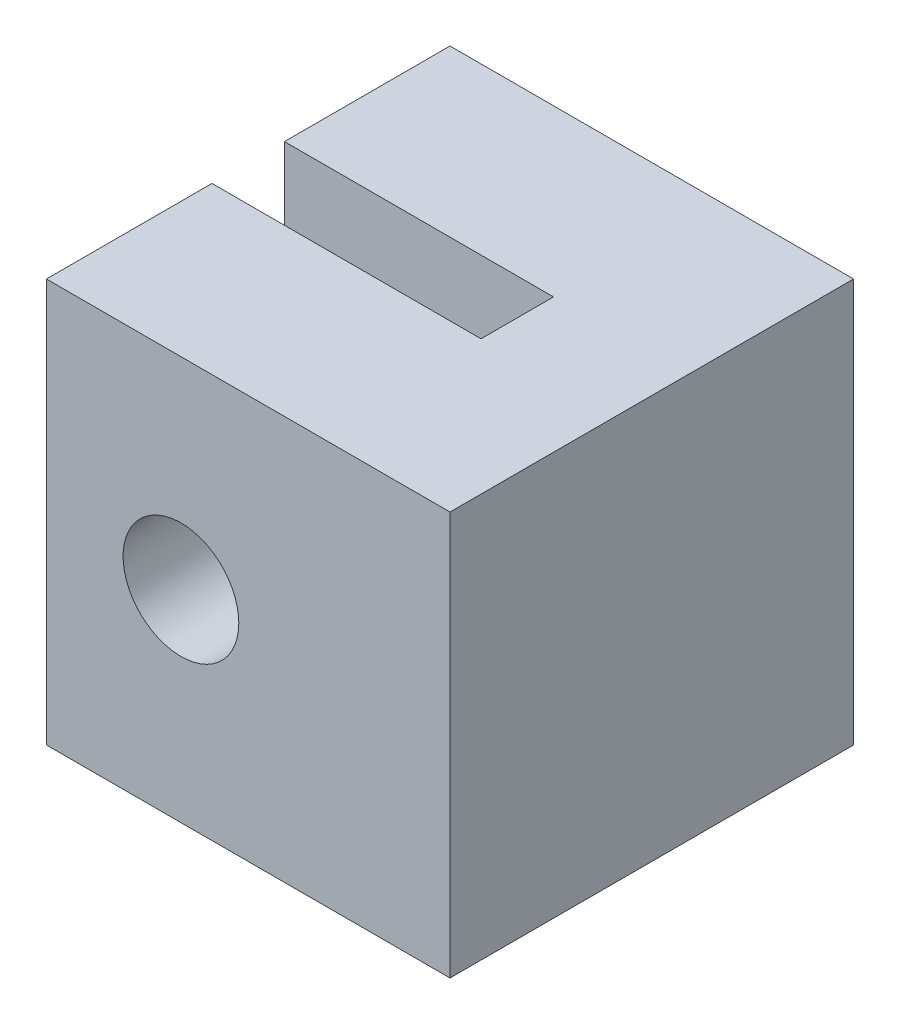
ISO-10303-21;
HEADER;
FILE_DESCRIPTION(('STEP AP214'),'2;1');
FILE_NAME('part.step','',(''),(''),'','','');
FILE_SCHEMA(('AUTOMOTIVE_DESIGN { 1 0 10303 214 1 1 1 1 }'));
ENDSEC;
DATA;
#1=APPLICATION_CONTEXT('core data for automotive mechanical design processes');
#2=APPLICATION_PROTOCOL_DEFINITION('international standard','automotive_design',2000,#1);
#3=PRODUCT_CONTEXT('',#1,'mechanical');
#4=PRODUCT('Part','Part','',(#3));
#5=PRODUCT_RELATED_PRODUCT_CATEGORY('part','',(#4));
#6=PRODUCT_DEFINITION_FORMATION('','',#4);
#7=PRODUCT_DEFINITION_CONTEXT('part definition',#1,'design');
#8=PRODUCT_DEFINITION('design','',#6,#7);
#9=PRODUCT_DEFINITION_SHAPE('','',#8);
#10=(LENGTH_UNIT() NAMED_UNIT(*) SI_UNIT(.MILLI.,.METRE.));
#11=(NAMED_UNIT(*) PLANE_ANGLE_UNIT() SI_UNIT($,.RADIAN.));
#12=(NAMED_UNIT(*) SI_UNIT($,.STERADIAN.) SOLID_ANGLE_UNIT());
#13=UNCERTAINTY_MEASURE_WITH_UNIT(LENGTH_MEASURE(1.E-05),#10,'distance_accuracy_value','');
#14=(GEOMETRIC_REPRESENTATION_CONTEXT(3) GLOBAL_UNCERTAINTY_ASSIGNED_CONTEXT((#13)) GLOBAL_UNIT_ASSIGNED_CONTEXT((#10,
#11,#12)) REPRESENTATION_CONTEXT('',''));
#15=CARTESIAN_POINT('',(0.,0.,0.));
#16=DIRECTION('',(0.,0.,1.));
#17=DIRECTION('',(1.,0.,0.));
#18=AXIS2_PLACEMENT_3D('',#15,#16,#17);
#19=CARTESIAN_POINT('',(-7.5,7.5,15.));
#20=DIRECTION('',(1.,0.,0.));
#21=DIRECTION('',(0.,1.,0.));
#22=AXIS2_PLACEMENT_3D('',#19,#20,#21);
#23=PLANE('',#22);
#24=DIRECTION('',(0.,0.,-1.));
#25=VECTOR('',#24,1.);
#26=CARTESIAN_POINT('',(-7.5,-7.5,15.));
#27=LINE('',#26,#25);
#28=CARTESIAN_POINT('',(-7.5,-7.5,6.152873555));
#29=VERTEX_POINT('',#28);
#30=CARTESIAN_POINT('',(-7.5,-7.5,0.));
#31=VERTEX_POINT('',#30);
#32=EDGE_CURVE('E43',#29,#31,#27,.T.);
#33=ORIENTED_EDGE('',*,*,#32,.F.);
#34=DIRECTION('',(0.,-1.,0.));
#35=VECTOR('',#34,1.);
#36=CARTESIAN_POINT('',(-7.5,7.5,6.152873555));
#37=LINE('',#36,#35);
#38=CARTESIAN_POINT('',(-7.5,7.5,6.152873555));
#39=VERTEX_POINT('',#38);
#40=EDGE_CURVE('E114',#39,#29,#37,.T.);
#41=ORIENTED_EDGE('',*,*,#40,.F.);
#42=DIRECTION('',(0.,0.,-1.));
#43=VECTOR('',#42,1.);
#44=CARTESIAN_POINT('',(-7.5,7.5,15.));
#45=LINE('',#44,#43);
#46=CARTESIAN_POINT('',(-7.5,7.5,0.));
#47=VERTEX_POINT('',#46);
#48=EDGE_CURVE('E81',#39,#47,#45,.T.);
#49=ORIENTED_EDGE('',*,*,#48,.T.);
#50=DIRECTION('',(0.,-1.,0.));
#51=VECTOR('',#50,1.);
#52=CARTESIAN_POINT('',(-7.5,7.5,0.));
#53=LINE('',#52,#51);
#54=EDGE_CURVE('E138',#47,#31,#53,.T.);
#55=ORIENTED_EDGE('',*,*,#54,.T.);
#56=EDGE_LOOP('',(#33,#41,#49,#55));
#57=FACE_BOUND('',#56,.T.);
#58=ADVANCED_FACE('F34',(#57),#23,.F.);
#59=CARTESIAN_POINT('',(-7.5,7.5,15.));
#60=VERTEX_POINT('',#59);
#61=CARTESIAN_POINT('',(-7.5,7.5,8.847126445));
#62=VERTEX_POINT('',#61);
#63=EDGE_CURVE('E156',#60,#62,#45,.T.);
#64=ORIENTED_EDGE('',*,*,#63,.T.);
#65=DIRECTION('',(0.,1.,0.));
#66=VECTOR('',#65,1.);
#67=CARTESIAN_POINT('',(-7.5,7.5,8.847126445));
#68=LINE('',#67,#66);
#69=CARTESIAN_POINT('',(-7.5,-7.5,8.847126445));
#70=VERTEX_POINT('',#69);
#71=EDGE_CURVE('E125',#70,#62,#68,.T.);
#72=ORIENTED_EDGE('',*,*,#71,.F.);
#73=CARTESIAN_POINT('',(-7.5,-7.5,15.));
#74=VERTEX_POINT('',#73);
#75=EDGE_CURVE('E11',#74,#70,#27,.T.);
#76=ORIENTED_EDGE('',*,*,#75,.F.);
#77=DIRECTION('',(0.,-1.,0.));
#78=VECTOR('',#77,1.);
#79=CARTESIAN_POINT('',(-7.5,7.5,15.));
#80=LINE('',#79,#78);
#81=EDGE_CURVE('E143',#60,#74,#80,.T.);
#82=ORIENTED_EDGE('',*,*,#81,.F.);
#83=EDGE_LOOP('',(#64,#72,#76,#82));
#84=FACE_BOUND('',#83,.T.);
#85=ADVANCED_FACE('F36',(#84),#23,.F.);
#86=CARTESIAN_POINT('',(-7.5,-7.5,15.));
#87=DIRECTION('',(0.,1.,0.));
#88=DIRECTION('',(-1.,0.,0.));
#89=AXIS2_PLACEMENT_3D('',#86,#87,#88);
#90=PLANE('',#89);
#91=DIRECTION('',(0.,0.,1.));
#92=VECTOR('',#91,1.);
#93=CARTESIAN_POINT('',(2.5,-7.5,6.152873555));
#94=LINE('',#93,#92);
#95=CARTESIAN_POINT('',(2.5,-7.5,6.152873555));
#96=VERTEX_POINT('',#95);
#97=CARTESIAN_POINT('',(2.5,-7.5,8.847126445));
#98=VERTEX_POINT('',#97);
#99=EDGE_CURVE('E121',#96,#98,#94,.T.);
#100=ORIENTED_EDGE('',*,*,#99,.F.);
#101=DIRECTION('',(-1.,0.,0.));
#102=VECTOR('',#101,1.);
#103=CARTESIAN_POINT('',(2.5,-7.5,6.152873555));
#104=LINE('',#103,#102);
#105=EDGE_CURVE('E110',#96,#29,#104,.T.);
#106=ORIENTED_EDGE('',*,*,#105,.T.);
#107=ORIENTED_EDGE('',*,*,#32,.T.);
#108=DIRECTION('',(1.,0.,0.));
#109=VECTOR('',#108,1.);
#110=CARTESIAN_POINT('',(-7.5,-7.5,0.));
#111=LINE('',#110,#109);
#112=CARTESIAN_POINT('',(7.5,-7.5,0.));
#113=VERTEX_POINT('',#112);
#114=EDGE_CURVE('E151',#31,#113,#111,.T.);
#115=ORIENTED_EDGE('',*,*,#114,.T.);
#116=DIRECTION('',(0.,0.,-1.));
#117=VECTOR('',#116,1.);
#118=CARTESIAN_POINT('',(7.5,-7.5,15.));
#119=LINE('',#118,#117);
#120=CARTESIAN_POINT('',(7.5,-7.5,15.));
#121=VERTEX_POINT('',#120);
#122=EDGE_CURVE('E162',#121,#113,#119,.T.);
#123=ORIENTED_EDGE('',*,*,#122,.F.);
#124=DIRECTION('',(1.,0.,0.));
#125=VECTOR('',#124,1.);
#126=CARTESIAN_POINT('',(-7.5,-7.5,15.));
#127=LINE('',#126,#125);
#128=EDGE_CURVE('E88',#74,#121,#127,.T.);
#129=ORIENTED_EDGE('',*,*,#128,.F.);
#130=ORIENTED_EDGE('',*,*,#75,.T.);
#131=DIRECTION('',(-1.,0.,0.));
#132=VECTOR('',#131,1.);
#133=CARTESIAN_POINT('',(2.5,-7.5,8.847126445));
#134=LINE('',#133,#132);
#135=EDGE_CURVE('E117',#98,#70,#134,.T.);
#136=ORIENTED_EDGE('',*,*,#135,.F.);
#137=EDGE_LOOP('',(#100,#106,#107,#115,#123,#129,#130,#136));
#138=FACE_BOUND('',#137,.T.);
#139=ADVANCED_FACE('F127',(#138),#90,.F.);
#140=CARTESIAN_POINT('',(7.5,7.5,15.));
#141=DIRECTION('',(-1.,0.,0.));
#142=DIRECTION('',(0.,-1.,0.));
#143=AXIS2_PLACEMENT_3D('',#140,#141,#142);
#144=PLANE('',#143);
#145=DIRECTION('',(0.,1.,0.));
#146=VECTOR('',#145,1.);
#147=CARTESIAN_POINT('',(7.5,7.5,0.));
#148=LINE('',#147,#146);
#149=CARTESIAN_POINT('',(7.5,7.5,0.));
#150=VERTEX_POINT('',#149);
#151=EDGE_CURVE('E153',#113,#150,#148,.T.);
#152=ORIENTED_EDGE('',*,*,#151,.T.);
#153=DIRECTION('',(0.,0.,-1.));
#154=VECTOR('',#153,1.);
#155=CARTESIAN_POINT('',(7.5,7.5,15.));
#156=LINE('',#155,#154);
#157=CARTESIAN_POINT('',(7.5,7.5,15.));
#158=VERTEX_POINT('',#157);
#159=EDGE_CURVE('E159',#158,#150,#156,.T.);
#160=ORIENTED_EDGE('',*,*,#159,.F.);
#161=DIRECTION('',(0.,1.,0.));
#162=VECTOR('',#161,1.);
#163=CARTESIAN_POINT('',(7.5,7.5,15.));
#164=LINE('',#163,#162);
#165=EDGE_CURVE('E147',#121,#158,#164,.T.);
#166=ORIENTED_EDGE('',*,*,#165,.F.);
#167=ORIENTED_EDGE('',*,*,#122,.T.);
#168=EDGE_LOOP('',(#152,#160,#166,#167));
#169=FACE_BOUND('',#168,.T.);
#170=ADVANCED_FACE('F180',(#169),#144,.F.);
#171=CARTESIAN_POINT('',(-7.5,7.5,15.));
#172=DIRECTION('',(0.,-1.,0.));
#173=DIRECTION('',(1.,0.,0.));
#174=AXIS2_PLACEMENT_3D('',#171,#172,#173);
#175=PLANE('',#174);
#176=ORIENTED_EDGE('',*,*,#48,.F.);
#177=DIRECTION('',(-1.,0.,0.));
#178=VECTOR('',#177,1.);
#179=CARTESIAN_POINT('',(2.5,7.5,6.152873555));
#180=LINE('',#179,#178);
#181=CARTESIAN_POINT('',(2.5,7.5,6.152873555));
#182=VERTEX_POINT('',#181);
#183=EDGE_CURVE('E136',#182,#39,#180,.T.);
#184=ORIENTED_EDGE('',*,*,#183,.F.);
#185=DIRECTION('',(0.,0.,-1.));
#186=VECTOR('',#185,1.);
#187=CARTESIAN_POINT('',(2.5,7.5,6.152873555));
#188=LINE('',#187,#186);
#189=CARTESIAN_POINT('',(2.5,7.5,8.847126445));
#190=VERTEX_POINT('',#189);
#191=EDGE_CURVE('E118',#190,#182,#188,.T.);
#192=ORIENTED_EDGE('',*,*,#191,.F.);
#193=DIRECTION('',(-1.,0.,0.));
#194=VECTOR('',#193,1.);
#195=CARTESIAN_POINT('',(2.5,7.5,8.847126445));
#196=LINE('',#195,#194);
#197=EDGE_CURVE('E139',#190,#62,#196,.T.);
#198=ORIENTED_EDGE('',*,*,#197,.T.);
#199=ORIENTED_EDGE('',*,*,#63,.F.);
#200=DIRECTION('',(-1.,0.,0.));
#201=VECTOR('',#200,1.);
#202=CARTESIAN_POINT('',(-7.5,7.5,15.));
#203=LINE('',#202,#201);
#204=EDGE_CURVE('E59',#158,#60,#203,.T.);
#205=ORIENTED_EDGE('',*,*,#204,.F.);
#206=ORIENTED_EDGE('',*,*,#159,.T.);
#207=DIRECTION('',(-1.,0.,0.));
#208=VECTOR('',#207,1.);
#209=CARTESIAN_POINT('',(-7.5,7.5,0.));
#210=LINE('',#209,#208);
#211=EDGE_CURVE('E145',#150,#47,#210,.T.);
#212=ORIENTED_EDGE('',*,*,#211,.T.);
#213=EDGE_LOOP('',(#176,#184,#192,#198,#199,#205,#206,#212));
#214=FACE_BOUND('',#213,.T.);
#215=ADVANCED_FACE('F185',(#214),#175,.F.);
#216=CARTESIAN_POINT('',(0.,0.,15.));
#217=DIRECTION('',(0.,0.,1.));
#218=DIRECTION('',(1.,0.,0.));
#219=AXIS2_PLACEMENT_3D('',#216,#217,#218);
#220=PLANE('',#219);
#221=CARTESIAN_POINT('',(-2.5,0.,15.));
#222=DIRECTION('',(0.,0.,1.));
#223=DIRECTION('',(1.,0.,0.));
#224=AXIS2_PLACEMENT_3D('',#221,#222,#223);
#225=CIRCLE('',#224,2.15);
#226=CARTESIAN_POINT('',(-0.35,0.,15.));
#227=VERTEX_POINT('',#226);
#228=EDGE_CURVE('E269',#227,#227,#225,.T.);
#229=ORIENTED_EDGE('',*,*,#228,.F.);
#230=EDGE_LOOP('',(#229));
#231=FACE_BOUND('',#230,.T.);
#232=ORIENTED_EDGE('',*,*,#81,.T.);
#233=ORIENTED_EDGE('',*,*,#128,.T.);
#234=ORIENTED_EDGE('',*,*,#165,.T.);
#235=ORIENTED_EDGE('',*,*,#204,.T.);
#236=EDGE_LOOP('',(#232,#233,#234,#235));
#237=FACE_BOUND('',#236,.T.);
#238=ADVANCED_FACE('F202',(#231,#237),#220,.T.);
#239=CARTESIAN_POINT('',(0.,0.,0.));
#240=DIRECTION('',(0.,0.,1.));
#241=DIRECTION('',(1.,0.,0.));
#242=AXIS2_PLACEMENT_3D('',#239,#240,#241);
#243=PLANE('',#242);
#244=CARTESIAN_POINT('',(-2.5,0.,0.));
#245=DIRECTION('',(0.,0.,1.));
#246=DIRECTION('',(1.,0.,0.));
#247=AXIS2_PLACEMENT_3D('',#244,#245,#246);
#248=CIRCLE('',#247,2.15);
#249=CARTESIAN_POINT('',(-0.35,0.,0.));
#250=VERTEX_POINT('',#249);
#251=EDGE_CURVE('E134',#250,#250,#248,.T.);
#252=ORIENTED_EDGE('',*,*,#251,.T.);
#253=EDGE_LOOP('',(#252));
#254=FACE_BOUND('',#253,.T.);
#255=ORIENTED_EDGE('',*,*,#54,.F.);
#256=ORIENTED_EDGE('',*,*,#211,.F.);
#257=ORIENTED_EDGE('',*,*,#151,.F.);
#258=ORIENTED_EDGE('',*,*,#114,.F.);
#259=EDGE_LOOP('',(#255,#256,#257,#258));
#260=FACE_BOUND('',#259,.T.);
#261=ADVANCED_FACE('F170',(#254,#260),#243,.F.);
#262=CARTESIAN_POINT('',(2.5,7.5,6.152873555));
#263=DIRECTION('',(0.,0.,-1.));
#264=DIRECTION('',(0.,1.,0.));
#265=AXIS2_PLACEMENT_3D('',#262,#263,#264);
#266=PLANE('',#265);
#267=CARTESIAN_POINT('',(-2.5,0.,6.152873555));
#268=DIRECTION('',(0.,0.,-1.));
#269=DIRECTION('',(0.,1.,0.));
#270=AXIS2_PLACEMENT_3D('',#267,#268,#269);
#271=CIRCLE('',#270,2.15);
#272=CARTESIAN_POINT('',(-2.5,2.15,6.152873555));
#273=VERTEX_POINT('',#272);
#274=EDGE_CURVE('E264',#273,#273,#271,.T.);
#275=ORIENTED_EDGE('',*,*,#274,.T.);
#276=EDGE_LOOP('',(#275));
#277=FACE_BOUND('',#276,.T.);
#278=ORIENTED_EDGE('',*,*,#40,.T.);
#279=ORIENTED_EDGE('',*,*,#105,.F.);
#280=DIRECTION('',(0.,-1.,0.));
#281=VECTOR('',#280,1.);
#282=CARTESIAN_POINT('',(2.5,7.5,6.152873555));
#283=LINE('',#282,#281);
#284=EDGE_CURVE('E113',#182,#96,#283,.T.);
#285=ORIENTED_EDGE('',*,*,#284,.F.);
#286=ORIENTED_EDGE('',*,*,#183,.T.);
#287=EDGE_LOOP('',(#278,#279,#285,#286));
#288=FACE_BOUND('',#287,.T.);
#289=ADVANCED_FACE('F112',(#277,#288),#266,.F.);
#290=CARTESIAN_POINT('',(2.5,7.5,8.847126445));
#291=DIRECTION('',(0.,0.,1.));
#292=DIRECTION('',(0.,-1.,0.));
#293=AXIS2_PLACEMENT_3D('',#290,#291,#292);
#294=PLANE('',#293);
#295=CARTESIAN_POINT('',(-2.5,0.,8.847126445));
#296=DIRECTION('',(0.,0.,1.));
#297=DIRECTION('',(0.,-1.,0.));
#298=AXIS2_PLACEMENT_3D('',#295,#296,#297);
#299=CIRCLE('',#298,2.15);
#300=CARTESIAN_POINT('',(-2.5,-2.15,8.847126445));
#301=VERTEX_POINT('',#300);
#302=EDGE_CURVE('E38',#301,#301,#299,.T.);
#303=ORIENTED_EDGE('',*,*,#302,.T.);
#304=EDGE_LOOP('',(#303));
#305=FACE_BOUND('',#304,.T.);
#306=ORIENTED_EDGE('',*,*,#71,.T.);
#307=ORIENTED_EDGE('',*,*,#197,.F.);
#308=DIRECTION('',(0.,1.,0.));
#309=VECTOR('',#308,1.);
#310=CARTESIAN_POINT('',(2.5,7.5,8.847126445));
#311=LINE('',#310,#309);
#312=EDGE_CURVE('E50',#98,#190,#311,.T.);
#313=ORIENTED_EDGE('',*,*,#312,.F.);
#314=ORIENTED_EDGE('',*,*,#135,.T.);
#315=EDGE_LOOP('',(#306,#307,#313,#314));
#316=FACE_BOUND('',#315,.T.);
#317=ADVANCED_FACE('F187',(#305,#316),#294,.F.);
#318=CARTESIAN_POINT('',(2.5,0.,0.));
#319=DIRECTION('',(-1.,0.,0.));
#320=DIRECTION('',(0.,-1.,0.));
#321=AXIS2_PLACEMENT_3D('',#318,#319,#320);
#322=PLANE('',#321);
#323=ORIENTED_EDGE('',*,*,#284,.T.);
#324=ORIENTED_EDGE('',*,*,#99,.T.);
#325=ORIENTED_EDGE('',*,*,#312,.T.);
#326=ORIENTED_EDGE('',*,*,#191,.T.);
#327=EDGE_LOOP('',(#323,#324,#325,#326));
#328=FACE_BOUND('',#327,.T.);
#329=ADVANCED_FACE('F120',(#328),#322,.T.);
#330=CARTESIAN_POINT('',(-2.5,0.,-22.));
#331=DIRECTION('',(0.,0.,1.));
#332=DIRECTION('',(1.,0.,0.));
#333=AXIS2_PLACEMENT_3D('',#330,#331,#332);
#334=CYLINDRICAL_SURFACE('',#333,2.15);
#335=ORIENTED_EDGE('',*,*,#228,.T.);
#336=EDGE_LOOP('',(#335));
#337=FACE_BOUND('',#336,.T.);
#338=ORIENTED_EDGE('',*,*,#302,.F.);
#339=EDGE_LOOP('',(#338));
#340=FACE_BOUND('',#339,.T.);
#341=ADVANCED_FACE('F195',(#337,#340),#334,.F.);
#342=ORIENTED_EDGE('',*,*,#274,.F.);
#343=EDGE_LOOP('',(#342));
#344=FACE_BOUND('',#343,.T.);
#345=ORIENTED_EDGE('',*,*,#251,.F.);
#346=EDGE_LOOP('',(#345));
#347=FACE_BOUND('',#346,.T.);
#348=ADVANCED_FACE('F249',(#344,#347),#334,.F.);
#349=CLOSED_SHELL('',(#58,#85,#139,#170,#215,#238,#261,#289,#317,#329,#341,#348));
#350=MANIFOLD_SOLID_BREP('B2',#349);
#351=ADVANCED_BREP_SHAPE_REPRESENTATION('',(#18,#350),#14);
#352=SHAPE_DEFINITION_REPRESENTATION(#9,#351);
ENDSEC;
END-ISO-10303-21;
